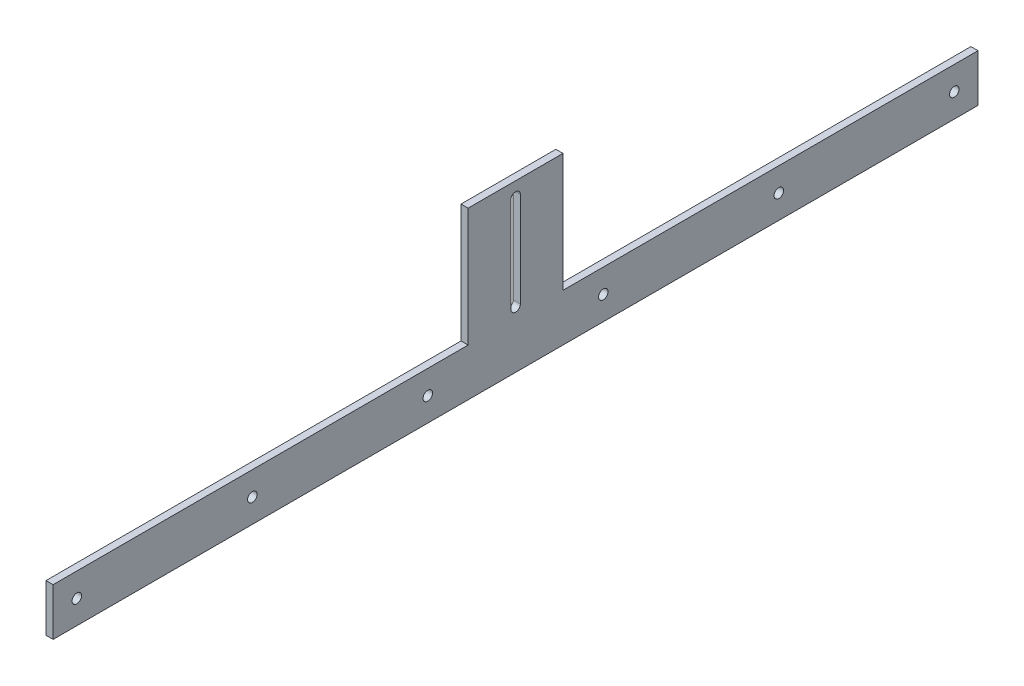
ISO-10303-21;
HEADER;
FILE_DESCRIPTION(('STEP AP214'),'2;1');
FILE_NAME('part.step','',(''),(''),'','','');
FILE_SCHEMA(('AUTOMOTIVE_DESIGN { 1 0 10303 214 1 1 1 1 }'));
ENDSEC;
DATA;
#1=APPLICATION_CONTEXT('core data for automotive mechanical design processes');
#2=APPLICATION_PROTOCOL_DEFINITION('international standard','automotive_design',2000,#1);
#3=PRODUCT_CONTEXT('',#1,'mechanical');
#4=PRODUCT('Part','Part','',(#3));
#5=PRODUCT_RELATED_PRODUCT_CATEGORY('part','',(#4));
#6=PRODUCT_DEFINITION_FORMATION('','',#4);
#7=PRODUCT_DEFINITION_CONTEXT('part definition',#1,'design');
#8=PRODUCT_DEFINITION('design','',#6,#7);
#9=PRODUCT_DEFINITION_SHAPE('','',#8);
#10=(LENGTH_UNIT() NAMED_UNIT(*) SI_UNIT(.MILLI.,.METRE.));
#11=(NAMED_UNIT(*) PLANE_ANGLE_UNIT() SI_UNIT($,.RADIAN.));
#12=(NAMED_UNIT(*) SI_UNIT($,.STERADIAN.) SOLID_ANGLE_UNIT());
#13=UNCERTAINTY_MEASURE_WITH_UNIT(LENGTH_MEASURE(1.E-05),#10,'distance_accuracy_value','');
#14=(GEOMETRIC_REPRESENTATION_CONTEXT(3) GLOBAL_UNCERTAINTY_ASSIGNED_CONTEXT((#13)) GLOBAL_UNIT_ASSIGNED_CONTEXT((#10,
#11,#12)) REPRESENTATION_CONTEXT('',''));
#15=CARTESIAN_POINT('',(0.,0.,0.));
#16=DIRECTION('',(0.,0.,1.));
#17=DIRECTION('',(1.,0.,0.));
#18=AXIS2_PLACEMENT_3D('',#15,#16,#17);
#19=CARTESIAN_POINT('',(3.,20.,0.));
#20=DIRECTION('',(0.,-1.,0.));
#21=DIRECTION('',(0.,0.,-1.));
#22=AXIS2_PLACEMENT_3D('',#19,#20,#21);
#23=PLANE('',#22);
#24=DIRECTION('',(1.,0.,0.));
#25=VECTOR('',#24,1.);
#26=CARTESIAN_POINT('',(0.,20.,-175.));
#27=LINE('',#26,#25);
#28=CARTESIAN_POINT('',(0.,20.,-175.));
#29=VERTEX_POINT('',#28);
#30=CARTESIAN_POINT('',(3.,20.,-175.));
#31=VERTEX_POINT('',#30);
#32=EDGE_CURVE('E186',#29,#31,#27,.T.);
#33=ORIENTED_EDGE('',*,*,#32,.F.);
#34=DIRECTION('',(0.,0.,1.));
#35=VECTOR('',#34,1.);
#36=CARTESIAN_POINT('',(0.,20.,0.));
#37=LINE('',#36,#35);
#38=CARTESIAN_POINT('',(0.,20.,0.));
#39=VERTEX_POINT('',#38);
#40=EDGE_CURVE('E81',#29,#39,#37,.T.);
#41=ORIENTED_EDGE('',*,*,#40,.T.);
#42=DIRECTION('',(-1.,0.,0.));
#43=VECTOR('',#42,1.);
#44=CARTESIAN_POINT('',(3.,20.,0.));
#45=LINE('',#44,#43);
#46=CARTESIAN_POINT('',(3.,20.,0.));
#47=VERTEX_POINT('',#46);
#48=EDGE_CURVE('E244',#47,#39,#45,.T.);
#49=ORIENTED_EDGE('',*,*,#48,.F.);
#50=DIRECTION('',(0.,0.,1.));
#51=VECTOR('',#50,1.);
#52=CARTESIAN_POINT('',(3.,20.,0.));
#53=LINE('',#52,#51);
#54=EDGE_CURVE('E59',#31,#47,#53,.T.);
#55=ORIENTED_EDGE('',*,*,#54,.F.);
#56=EDGE_LOOP('',(#33,#41,#49,#55));
#57=FACE_BOUND('',#56,.T.);
#58=ADVANCED_FACE('F35',(#57),#23,.F.);
#59=CARTESIAN_POINT('',(3.,0.,0.));
#60=DIRECTION('',(-1.,0.,0.));
#61=DIRECTION('',(0.,0.,1.));
#62=AXIS2_PLACEMENT_3D('',#59,#60,#61);
#63=PLANE('',#62);
#64=DIRECTION('',(0.,-1.,0.));
#65=VECTOR('',#64,1.);
#66=CARTESIAN_POINT('',(3.,0.,0.));
#67=LINE('',#66,#65);
#68=CARTESIAN_POINT('',(3.,0.,0.));
#69=VERTEX_POINT('',#68);
#70=EDGE_CURVE('E235',#47,#69,#67,.T.);
#71=ORIENTED_EDGE('',*,*,#70,.T.);
#72=DIRECTION('',(0.,0.,-1.));
#73=VECTOR('',#72,1.);
#74=CARTESIAN_POINT('',(3.,0.,0.));
#75=LINE('',#74,#73);
#76=CARTESIAN_POINT('',(3.,0.,-390.));
#77=VERTEX_POINT('',#76);
#78=EDGE_CURVE('E88',#69,#77,#75,.T.);
#79=ORIENTED_EDGE('',*,*,#78,.T.);
#80=DIRECTION('',(0.,1.,0.));
#81=VECTOR('',#80,1.);
#82=CARTESIAN_POINT('',(3.,0.,-390.));
#83=LINE('',#82,#81);
#84=CARTESIAN_POINT('',(3.,20.,-390.));
#85=VERTEX_POINT('',#84);
#86=EDGE_CURVE('E239',#77,#85,#83,.T.);
#87=ORIENTED_EDGE('',*,*,#86,.T.);
#88=CARTESIAN_POINT('',(3.,20.,-215.));
#89=VERTEX_POINT('',#88);
#90=EDGE_CURVE('E241',#85,#89,#53,.T.);
#91=ORIENTED_EDGE('',*,*,#90,.T.);
#92=DIRECTION('',(0.,1.,0.));
#93=VECTOR('',#92,1.);
#94=CARTESIAN_POINT('',(3.,70.,-215.));
#95=LINE('',#94,#93);
#96=CARTESIAN_POINT('',(3.,70.,-215.));
#97=VERTEX_POINT('',#96);
#98=EDGE_CURVE('E50',#89,#97,#95,.T.);
#99=ORIENTED_EDGE('',*,*,#98,.T.);
#100=DIRECTION('',(0.,0.,1.));
#101=VECTOR('',#100,1.);
#102=CARTESIAN_POINT('',(3.,70.,-175.));
#103=LINE('',#102,#101);
#104=CARTESIAN_POINT('',(3.,70.,-175.));
#105=VERTEX_POINT('',#104);
#106=EDGE_CURVE('E180',#97,#105,#103,.T.);
#107=ORIENTED_EDGE('',*,*,#106,.T.);
#108=DIRECTION('',(0.,-1.,0.));
#109=VECTOR('',#108,1.);
#110=CARTESIAN_POINT('',(3.,70.,-175.));
#111=LINE('',#110,#109);
#112=EDGE_CURVE('E173',#105,#31,#111,.T.);
#113=ORIENTED_EDGE('',*,*,#112,.T.);
#114=ORIENTED_EDGE('',*,*,#54,.T.);
#115=EDGE_LOOP('',(#71,#79,#87,#91,#99,#107,#113,#114));
#116=FACE_BOUND('',#115,.T.);
#117=CARTESIAN_POINT('',(3.,10.,-10.));
#118=DIRECTION('',(1.,0.,0.));
#119=DIRECTION('',(0.,0.,-1.));
#120=AXIS2_PLACEMENT_3D('',#117,#118,#119);
#121=CIRCLE('',#120,2.);
#122=CARTESIAN_POINT('',(3.,10.,-12.));
#123=VERTEX_POINT('',#122);
#124=EDGE_CURVE('E229',#123,#123,#121,.T.);
#125=ORIENTED_EDGE('',*,*,#124,.F.);
#126=EDGE_LOOP('',(#125));
#127=FACE_BOUND('',#126,.T.);
#128=CARTESIAN_POINT('',(3.,10.,-380.));
#129=DIRECTION('',(1.,0.,0.));
#130=DIRECTION('',(0.,0.,-1.));
#131=AXIS2_PLACEMENT_3D('',#128,#129,#130);
#132=CIRCLE('',#131,2.);
#133=CARTESIAN_POINT('',(3.,10.,-382.));
#134=VERTEX_POINT('',#133);
#135=EDGE_CURVE('E223',#134,#134,#132,.T.);
#136=ORIENTED_EDGE('',*,*,#135,.F.);
#137=EDGE_LOOP('',(#136));
#138=FACE_BOUND('',#137,.T.);
#139=CARTESIAN_POINT('',(3.,10.,-84.));
#140=DIRECTION('',(1.,0.,0.));
#141=DIRECTION('',(0.,0.,-1.));
#142=AXIS2_PLACEMENT_3D('',#139,#140,#141);
#143=CIRCLE('',#142,2.);
#144=CARTESIAN_POINT('',(3.,10.,-86.));
#145=VERTEX_POINT('',#144);
#146=EDGE_CURVE('E217',#145,#145,#143,.T.);
#147=ORIENTED_EDGE('',*,*,#146,.F.);
#148=EDGE_LOOP('',(#147));
#149=FACE_BOUND('',#148,.T.);
#150=CARTESIAN_POINT('',(3.,10.,-158.));
#151=DIRECTION('',(1.,0.,0.));
#152=DIRECTION('',(0.,0.,-1.));
#153=AXIS2_PLACEMENT_3D('',#150,#151,#152);
#154=CIRCLE('',#153,2.00000000000003);
#155=CARTESIAN_POINT('',(3.,10.,-160.));
#156=VERTEX_POINT('',#155);
#157=EDGE_CURVE('E211',#156,#156,#154,.T.);
#158=ORIENTED_EDGE('',*,*,#157,.F.);
#159=EDGE_LOOP('',(#158));
#160=FACE_BOUND('',#159,.T.);
#161=CARTESIAN_POINT('',(3.,10.,-232.));
#162=DIRECTION('',(1.,0.,0.));
#163=DIRECTION('',(0.,0.,-1.));
#164=AXIS2_PLACEMENT_3D('',#161,#162,#163);
#165=CIRCLE('',#164,2.);
#166=CARTESIAN_POINT('',(3.,10.,-234.));
#167=VERTEX_POINT('',#166);
#168=EDGE_CURVE('E205',#167,#167,#165,.T.);
#169=ORIENTED_EDGE('',*,*,#168,.F.);
#170=EDGE_LOOP('',(#169));
#171=FACE_BOUND('',#170,.T.);
#172=CARTESIAN_POINT('',(3.,10.,-306.));
#173=DIRECTION('',(1.,0.,0.));
#174=DIRECTION('',(0.,0.,-1.));
#175=AXIS2_PLACEMENT_3D('',#172,#173,#174);
#176=CIRCLE('',#175,2.);
#177=CARTESIAN_POINT('',(3.,10.,-308.));
#178=VERTEX_POINT('',#177);
#179=EDGE_CURVE('E199',#178,#178,#176,.T.);
#180=ORIENTED_EDGE('',*,*,#179,.F.);
#181=EDGE_LOOP('',(#180));
#182=FACE_BOUND('',#181,.T.);
#183=CARTESIAN_POINT('',(3.,64.,-195.));
#184=DIRECTION('',(1.,0.,0.));
#185=DIRECTION('',(0.,0.,-1.));
#186=AXIS2_PLACEMENT_3D('',#183,#184,#185);
#187=CIRCLE('',#186,2.);
#188=CARTESIAN_POINT('',(3.,64.,-197.));
#189=VERTEX_POINT('',#188);
#190=CARTESIAN_POINT('',(3.,64.,-193.));
#191=VERTEX_POINT('',#190);
#192=EDGE_CURVE('E141',#189,#191,#187,.T.);
#193=ORIENTED_EDGE('',*,*,#192,.F.);
#194=DIRECTION('',(0.,1.,0.));
#195=VECTOR('',#194,1.);
#196=CARTESIAN_POINT('',(3.,64.,-197.));
#197=LINE('',#196,#195);
#198=CARTESIAN_POINT('',(3.,24.,-197.));
#199=VERTEX_POINT('',#198);
#200=EDGE_CURVE('E158',#199,#189,#197,.T.);
#201=ORIENTED_EDGE('',*,*,#200,.F.);
#202=CARTESIAN_POINT('',(3.,24.,-195.));
#203=DIRECTION('',(1.,0.,0.));
#204=DIRECTION('',(0.,0.,-1.));
#205=AXIS2_PLACEMENT_3D('',#202,#203,#204);
#206=CIRCLE('',#205,2.);
#207=CARTESIAN_POINT('',(3.,24.,-193.));
#208=VERTEX_POINT('',#207);
#209=EDGE_CURVE('E161',#208,#199,#206,.T.);
#210=ORIENTED_EDGE('',*,*,#209,.F.);
#211=DIRECTION('',(0.,-1.,0.));
#212=VECTOR('',#211,1.);
#213=CARTESIAN_POINT('',(3.,64.,-193.));
#214=LINE('',#213,#212);
#215=EDGE_CURVE('E167',#191,#208,#214,.T.);
#216=ORIENTED_EDGE('',*,*,#215,.F.);
#217=EDGE_LOOP('',(#193,#201,#210,#216));
#218=FACE_BOUND('',#217,.T.);
#219=ADVANCED_FACE('F271',(#116,#127,#138,#149,#160,#171,#182,#218),#63,.F.);
#220=CARTESIAN_POINT('',(0.,0.,0.));
#221=DIRECTION('',(-1.,0.,0.));
#222=DIRECTION('',(0.,0.,1.));
#223=AXIS2_PLACEMENT_3D('',#220,#221,#222);
#224=PLANE('',#223);
#225=CARTESIAN_POINT('',(0.,10.,-232.));
#226=DIRECTION('',(1.,0.,0.));
#227=DIRECTION('',(0.,0.,-1.));
#228=AXIS2_PLACEMENT_3D('',#225,#226,#227);
#229=CIRCLE('',#228,2.);
#230=CARTESIAN_POINT('',(0.,10.,-234.));
#231=VERTEX_POINT('',#230);
#232=EDGE_CURVE('E202',#231,#231,#229,.T.);
#233=ORIENTED_EDGE('',*,*,#232,.T.);
#234=EDGE_LOOP('',(#233));
#235=FACE_BOUND('',#234,.T.);
#236=CARTESIAN_POINT('',(0.,10.,-84.));
#237=DIRECTION('',(1.,0.,0.));
#238=DIRECTION('',(0.,0.,-1.));
#239=AXIS2_PLACEMENT_3D('',#236,#237,#238);
#240=CIRCLE('',#239,2.);
#241=CARTESIAN_POINT('',(0.,10.,-86.));
#242=VERTEX_POINT('',#241);
#243=EDGE_CURVE('E214',#242,#242,#240,.T.);
#244=ORIENTED_EDGE('',*,*,#243,.T.);
#245=EDGE_LOOP('',(#244));
#246=FACE_BOUND('',#245,.T.);
#247=CARTESIAN_POINT('',(0.,10.,-10.));
#248=DIRECTION('',(1.,0.,0.));
#249=DIRECTION('',(0.,0.,-1.));
#250=AXIS2_PLACEMENT_3D('',#247,#248,#249);
#251=CIRCLE('',#250,2.);
#252=CARTESIAN_POINT('',(0.,10.,-12.));
#253=VERTEX_POINT('',#252);
#254=EDGE_CURVE('E226',#253,#253,#251,.T.);
#255=ORIENTED_EDGE('',*,*,#254,.T.);
#256=EDGE_LOOP('',(#255));
#257=FACE_BOUND('',#256,.T.);
#258=DIRECTION('',(0.,-1.,0.));
#259=VECTOR('',#258,1.);
#260=CARTESIAN_POINT('',(0.,0.,0.));
#261=LINE('',#260,#259);
#262=CARTESIAN_POINT('',(0.,0.,0.));
#263=VERTEX_POINT('',#262);
#264=EDGE_CURVE('E232',#39,#263,#261,.T.);
#265=ORIENTED_EDGE('',*,*,#264,.F.);
#266=ORIENTED_EDGE('',*,*,#40,.F.);
#267=DIRECTION('',(0.,-1.,0.));
#268=VECTOR('',#267,1.);
#269=CARTESIAN_POINT('',(0.,70.,-175.));
#270=LINE('',#269,#268);
#271=CARTESIAN_POINT('',(0.,70.,-175.));
#272=VERTEX_POINT('',#271);
#273=EDGE_CURVE('E177',#272,#29,#270,.T.);
#274=ORIENTED_EDGE('',*,*,#273,.F.);
#275=DIRECTION('',(0.,0.,1.));
#276=VECTOR('',#275,1.);
#277=CARTESIAN_POINT('',(0.,70.,-175.));
#278=LINE('',#277,#276);
#279=CARTESIAN_POINT('',(0.,70.,-215.));
#280=VERTEX_POINT('',#279);
#281=EDGE_CURVE('E183',#280,#272,#278,.T.);
#282=ORIENTED_EDGE('',*,*,#281,.F.);
#283=DIRECTION('',(0.,1.,0.));
#284=VECTOR('',#283,1.);
#285=CARTESIAN_POINT('',(0.,70.,-215.));
#286=LINE('',#285,#284);
#287=CARTESIAN_POINT('',(0.,20.,-215.));
#288=VERTEX_POINT('',#287);
#289=EDGE_CURVE('E179',#288,#280,#286,.T.);
#290=ORIENTED_EDGE('',*,*,#289,.F.);
#291=CARTESIAN_POINT('',(0.,20.,-390.));
#292=VERTEX_POINT('',#291);
#293=EDGE_CURVE('E237',#292,#288,#37,.T.);
#294=ORIENTED_EDGE('',*,*,#293,.F.);
#295=DIRECTION('',(0.,1.,0.));
#296=VECTOR('',#295,1.);
#297=CARTESIAN_POINT('',(0.,0.,-390.));
#298=LINE('',#297,#296);
#299=CARTESIAN_POINT('',(0.,0.,-390.));
#300=VERTEX_POINT('',#299);
#301=EDGE_CURVE('E249',#300,#292,#298,.T.);
#302=ORIENTED_EDGE('',*,*,#301,.F.);
#303=DIRECTION('',(0.,0.,-1.));
#304=VECTOR('',#303,1.);
#305=CARTESIAN_POINT('',(0.,0.,0.));
#306=LINE('',#305,#304);
#307=EDGE_CURVE('E247',#263,#300,#306,.T.);
#308=ORIENTED_EDGE('',*,*,#307,.F.);
#309=EDGE_LOOP('',(#265,#266,#274,#282,#290,#294,#302,#308));
#310=FACE_BOUND('',#309,.T.);
#311=CARTESIAN_POINT('',(0.,10.,-380.));
#312=DIRECTION('',(1.,0.,0.));
#313=DIRECTION('',(0.,0.,-1.));
#314=AXIS2_PLACEMENT_3D('',#311,#312,#313);
#315=CIRCLE('',#314,2.);
#316=CARTESIAN_POINT('',(0.,10.,-382.));
#317=VERTEX_POINT('',#316);
#318=EDGE_CURVE('E220',#317,#317,#315,.T.);
#319=ORIENTED_EDGE('',*,*,#318,.T.);
#320=EDGE_LOOP('',(#319));
#321=FACE_BOUND('',#320,.T.);
#322=CARTESIAN_POINT('',(0.,10.,-158.));
#323=DIRECTION('',(1.,0.,0.));
#324=DIRECTION('',(0.,0.,-1.));
#325=AXIS2_PLACEMENT_3D('',#322,#323,#324);
#326=CIRCLE('',#325,2.00000000000003);
#327=CARTESIAN_POINT('',(0.,10.,-160.));
#328=VERTEX_POINT('',#327);
#329=EDGE_CURVE('E208',#328,#328,#326,.T.);
#330=ORIENTED_EDGE('',*,*,#329,.T.);
#331=EDGE_LOOP('',(#330));
#332=FACE_BOUND('',#331,.T.);
#333=CARTESIAN_POINT('',(0.,10.,-306.));
#334=DIRECTION('',(1.,0.,0.));
#335=DIRECTION('',(0.,0.,-1.));
#336=AXIS2_PLACEMENT_3D('',#333,#334,#335);
#337=CIRCLE('',#336,2.);
#338=CARTESIAN_POINT('',(0.,10.,-308.));
#339=VERTEX_POINT('',#338);
#340=EDGE_CURVE('E193',#339,#339,#337,.T.);
#341=ORIENTED_EDGE('',*,*,#340,.T.);
#342=EDGE_LOOP('',(#341));
#343=FACE_BOUND('',#342,.T.);
#344=DIRECTION('',(0.,1.,0.));
#345=VECTOR('',#344,1.);
#346=CARTESIAN_POINT('',(0.,64.,-197.));
#347=LINE('',#346,#345);
#348=CARTESIAN_POINT('',(0.,24.,-197.));
#349=VERTEX_POINT('',#348);
#350=CARTESIAN_POINT('',(0.,64.,-197.));
#351=VERTEX_POINT('',#350);
#352=EDGE_CURVE('E146',#349,#351,#347,.T.);
#353=ORIENTED_EDGE('',*,*,#352,.T.);
#354=CARTESIAN_POINT('',(0.,64.,-195.));
#355=DIRECTION('',(1.,0.,0.));
#356=DIRECTION('',(0.,0.,-1.));
#357=AXIS2_PLACEMENT_3D('',#354,#355,#356);
#358=CIRCLE('',#357,2.);
#359=CARTESIAN_POINT('',(0.,64.,-193.));
#360=VERTEX_POINT('',#359);
#361=EDGE_CURVE('E138',#351,#360,#358,.T.);
#362=ORIENTED_EDGE('',*,*,#361,.T.);
#363=DIRECTION('',(0.,-1.,0.));
#364=VECTOR('',#363,1.);
#365=CARTESIAN_POINT('',(0.,64.,-193.));
#366=LINE('',#365,#364);
#367=CARTESIAN_POINT('',(0.,24.,-193.));
#368=VERTEX_POINT('',#367);
#369=EDGE_CURVE('E150',#360,#368,#366,.T.);
#370=ORIENTED_EDGE('',*,*,#369,.T.);
#371=CARTESIAN_POINT('',(0.,24.,-195.));
#372=DIRECTION('',(1.,0.,0.));
#373=DIRECTION('',(0.,0.,-1.));
#374=AXIS2_PLACEMENT_3D('',#371,#372,#373);
#375=CIRCLE('',#374,2.);
#376=EDGE_CURVE('E154',#368,#349,#375,.T.);
#377=ORIENTED_EDGE('',*,*,#376,.T.);
#378=EDGE_LOOP('',(#353,#362,#370,#377));
#379=FACE_BOUND('',#378,.T.);
#380=ADVANCED_FACE('F156',(#235,#246,#257,#310,#321,#332,#343,#379),#224,.T.);
#381=CARTESIAN_POINT('',(3.,0.,0.));
#382=DIRECTION('',(0.,0.,-1.));
#383=DIRECTION('',(-1.,0.,0.));
#384=AXIS2_PLACEMENT_3D('',#381,#382,#383);
#385=PLANE('',#384);
#386=ORIENTED_EDGE('',*,*,#264,.T.);
#387=DIRECTION('',(-1.,0.,0.));
#388=VECTOR('',#387,1.);
#389=CARTESIAN_POINT('',(3.,0.,0.));
#390=LINE('',#389,#388);
#391=EDGE_CURVE('E11',#69,#263,#390,.T.);
#392=ORIENTED_EDGE('',*,*,#391,.F.);
#393=ORIENTED_EDGE('',*,*,#70,.F.);
#394=ORIENTED_EDGE('',*,*,#48,.T.);
#395=EDGE_LOOP('',(#386,#392,#393,#394));
#396=FACE_BOUND('',#395,.T.);
#397=ADVANCED_FACE('F37',(#396),#385,.F.);
#398=CARTESIAN_POINT('',(3.,0.,0.));
#399=DIRECTION('',(0.,1.,0.));
#400=DIRECTION('',(0.,0.,1.));
#401=AXIS2_PLACEMENT_3D('',#398,#399,#400);
#402=PLANE('',#401);
#403=ORIENTED_EDGE('',*,*,#307,.T.);
#404=DIRECTION('',(-1.,0.,0.));
#405=VECTOR('',#404,1.);
#406=CARTESIAN_POINT('',(3.,0.,-390.));
#407=LINE('',#406,#405);
#408=EDGE_CURVE('E43',#77,#300,#407,.T.);
#409=ORIENTED_EDGE('',*,*,#408,.F.);
#410=ORIENTED_EDGE('',*,*,#78,.F.);
#411=ORIENTED_EDGE('',*,*,#391,.T.);
#412=EDGE_LOOP('',(#403,#409,#410,#411));
#413=FACE_BOUND('',#412,.T.);
#414=ADVANCED_FACE('F277',(#413),#402,.F.);
#415=CARTESIAN_POINT('',(3.,0.,-390.));
#416=DIRECTION('',(0.,0.,1.));
#417=DIRECTION('',(1.,0.,0.));
#418=AXIS2_PLACEMENT_3D('',#415,#416,#417);
#419=PLANE('',#418);
#420=ORIENTED_EDGE('',*,*,#301,.T.);
#421=DIRECTION('',(-1.,0.,0.));
#422=VECTOR('',#421,1.);
#423=CARTESIAN_POINT('',(3.,20.,-390.));
#424=LINE('',#423,#422);
#425=EDGE_CURVE('E254',#85,#292,#424,.T.);
#426=ORIENTED_EDGE('',*,*,#425,.F.);
#427=ORIENTED_EDGE('',*,*,#86,.F.);
#428=ORIENTED_EDGE('',*,*,#408,.T.);
#429=EDGE_LOOP('',(#420,#426,#427,#428));
#430=FACE_BOUND('',#429,.T.);
#431=ADVANCED_FACE('F260',(#430),#419,.F.);
#432=ORIENTED_EDGE('',*,*,#293,.T.);
#433=DIRECTION('',(1.,0.,0.));
#434=VECTOR('',#433,1.);
#435=CARTESIAN_POINT('',(0.,20.,-215.));
#436=LINE('',#435,#434);
#437=EDGE_CURVE('E196',#288,#89,#436,.T.);
#438=ORIENTED_EDGE('',*,*,#437,.T.);
#439=ORIENTED_EDGE('',*,*,#90,.F.);
#440=ORIENTED_EDGE('',*,*,#425,.T.);
#441=EDGE_LOOP('',(#432,#438,#439,#440));
#442=FACE_BOUND('',#441,.T.);
#443=ADVANCED_FACE('F269',(#442),#23,.F.);
#444=CARTESIAN_POINT('',(3.,10.,-10.));
#445=DIRECTION('',(-1.,0.,0.));
#446=DIRECTION('',(0.,0.,1.));
#447=AXIS2_PLACEMENT_3D('',#444,#445,#446);
#448=CYLINDRICAL_SURFACE('',#447,2.);
#449=ORIENTED_EDGE('',*,*,#124,.T.);
#450=EDGE_LOOP('',(#449));
#451=FACE_BOUND('',#450,.T.);
#452=ORIENTED_EDGE('',*,*,#254,.F.);
#453=EDGE_LOOP('',(#452));
#454=FACE_BOUND('',#453,.T.);
#455=ADVANCED_FACE('F292',(#451,#454),#448,.F.);
#456=CARTESIAN_POINT('',(3.,10.,-380.));
#457=DIRECTION('',(-1.,0.,0.));
#458=DIRECTION('',(0.,0.,1.));
#459=AXIS2_PLACEMENT_3D('',#456,#457,#458);
#460=CYLINDRICAL_SURFACE('',#459,2.);
#461=ORIENTED_EDGE('',*,*,#135,.T.);
#462=EDGE_LOOP('',(#461));
#463=FACE_BOUND('',#462,.T.);
#464=ORIENTED_EDGE('',*,*,#318,.F.);
#465=EDGE_LOOP('',(#464));
#466=FACE_BOUND('',#465,.T.);
#467=ADVANCED_FACE('F296',(#463,#466),#460,.F.);
#468=CARTESIAN_POINT('',(3.,10.,-84.));
#469=DIRECTION('',(-1.,0.,0.));
#470=DIRECTION('',(0.,0.,1.));
#471=AXIS2_PLACEMENT_3D('',#468,#469,#470);
#472=CYLINDRICAL_SURFACE('',#471,2.);
#473=ORIENTED_EDGE('',*,*,#146,.T.);
#474=EDGE_LOOP('',(#473));
#475=FACE_BOUND('',#474,.T.);
#476=ORIENTED_EDGE('',*,*,#243,.F.);
#477=EDGE_LOOP('',(#476));
#478=FACE_BOUND('',#477,.T.);
#479=ADVANCED_FACE('F302',(#475,#478),#472,.F.);
#480=CARTESIAN_POINT('',(3.,10.,-158.));
#481=DIRECTION('',(-1.,0.,0.));
#482=DIRECTION('',(0.,0.,1.));
#483=AXIS2_PLACEMENT_3D('',#480,#481,#482);
#484=CYLINDRICAL_SURFACE('',#483,2.00000000000003);
#485=ORIENTED_EDGE('',*,*,#157,.T.);
#486=EDGE_LOOP('',(#485));
#487=FACE_BOUND('',#486,.T.);
#488=ORIENTED_EDGE('',*,*,#329,.F.);
#489=EDGE_LOOP('',(#488));
#490=FACE_BOUND('',#489,.T.);
#491=ADVANCED_FACE('F318',(#487,#490),#484,.F.);
#492=CARTESIAN_POINT('',(3.,10.,-232.));
#493=DIRECTION('',(-1.,0.,0.));
#494=DIRECTION('',(0.,0.,1.));
#495=AXIS2_PLACEMENT_3D('',#492,#493,#494);
#496=CYLINDRICAL_SURFACE('',#495,2.);
#497=ORIENTED_EDGE('',*,*,#168,.T.);
#498=EDGE_LOOP('',(#497));
#499=FACE_BOUND('',#498,.T.);
#500=ORIENTED_EDGE('',*,*,#232,.F.);
#501=EDGE_LOOP('',(#500));
#502=FACE_BOUND('',#501,.T.);
#503=ADVANCED_FACE('F323',(#499,#502),#496,.F.);
#504=CARTESIAN_POINT('',(3.,10.,-306.));
#505=DIRECTION('',(-1.,0.,0.));
#506=DIRECTION('',(0.,0.,1.));
#507=AXIS2_PLACEMENT_3D('',#504,#505,#506);
#508=CYLINDRICAL_SURFACE('',#507,2.);
#509=ORIENTED_EDGE('',*,*,#179,.T.);
#510=EDGE_LOOP('',(#509));
#511=FACE_BOUND('',#510,.T.);
#512=ORIENTED_EDGE('',*,*,#340,.F.);
#513=EDGE_LOOP('',(#512));
#514=FACE_BOUND('',#513,.T.);
#515=ADVANCED_FACE('F329',(#511,#514),#508,.F.);
#516=CARTESIAN_POINT('',(0.,70.,-175.));
#517=DIRECTION('',(0.,0.,1.));
#518=DIRECTION('',(1.,0.,0.));
#519=AXIS2_PLACEMENT_3D('',#516,#517,#518);
#520=PLANE('',#519);
#521=ORIENTED_EDGE('',*,*,#112,.F.);
#522=DIRECTION('',(1.,0.,0.));
#523=VECTOR('',#522,1.);
#524=CARTESIAN_POINT('',(0.,70.,-175.));
#525=LINE('',#524,#523);
#526=EDGE_CURVE('E191',#272,#105,#525,.T.);
#527=ORIENTED_EDGE('',*,*,#526,.F.);
#528=ORIENTED_EDGE('',*,*,#273,.T.);
#529=ORIENTED_EDGE('',*,*,#32,.T.);
#530=EDGE_LOOP('',(#521,#527,#528,#529));
#531=FACE_BOUND('',#530,.T.);
#532=ADVANCED_FACE('F333',(#531),#520,.T.);
#533=CARTESIAN_POINT('',(0.,70.,-175.));
#534=DIRECTION('',(0.,1.,0.));
#535=DIRECTION('',(0.,0.,1.));
#536=AXIS2_PLACEMENT_3D('',#533,#534,#535);
#537=PLANE('',#536);
#538=ORIENTED_EDGE('',*,*,#106,.F.);
#539=DIRECTION('',(1.,0.,0.));
#540=VECTOR('',#539,1.);
#541=CARTESIAN_POINT('',(0.,70.,-215.));
#542=LINE('',#541,#540);
#543=EDGE_CURVE('E194',#280,#97,#542,.T.);
#544=ORIENTED_EDGE('',*,*,#543,.F.);
#545=ORIENTED_EDGE('',*,*,#281,.T.);
#546=ORIENTED_EDGE('',*,*,#526,.T.);
#547=EDGE_LOOP('',(#538,#544,#545,#546));
#548=FACE_BOUND('',#547,.T.);
#549=ADVANCED_FACE('F337',(#548),#537,.T.);
#550=CARTESIAN_POINT('',(0.,70.,-215.));
#551=DIRECTION('',(0.,0.,-1.));
#552=DIRECTION('',(-1.,0.,0.));
#553=AXIS2_PLACEMENT_3D('',#550,#551,#552);
#554=PLANE('',#553);
#555=ORIENTED_EDGE('',*,*,#98,.F.);
#556=ORIENTED_EDGE('',*,*,#437,.F.);
#557=ORIENTED_EDGE('',*,*,#289,.T.);
#558=ORIENTED_EDGE('',*,*,#543,.T.);
#559=EDGE_LOOP('',(#555,#556,#557,#558));
#560=FACE_BOUND('',#559,.T.);
#561=ADVANCED_FACE('F339',(#560),#554,.T.);
#562=CARTESIAN_POINT('',(0.,64.,-195.));
#563=DIRECTION('',(1.,0.,0.));
#564=DIRECTION('',(0.,0.,-1.));
#565=AXIS2_PLACEMENT_3D('',#562,#563,#564);
#566=CYLINDRICAL_SURFACE('',#565,2.);
#567=ORIENTED_EDGE('',*,*,#192,.T.);
#568=DIRECTION('',(1.,0.,0.));
#569=VECTOR('',#568,1.);
#570=CARTESIAN_POINT('',(0.,64.,-193.));
#571=LINE('',#570,#569);
#572=EDGE_CURVE('E134',#360,#191,#571,.T.);
#573=ORIENTED_EDGE('',*,*,#572,.F.);
#574=ORIENTED_EDGE('',*,*,#361,.F.);
#575=DIRECTION('',(1.,0.,0.));
#576=VECTOR('',#575,1.);
#577=CARTESIAN_POINT('',(0.,64.,-197.));
#578=LINE('',#577,#576);
#579=EDGE_CURVE('E171',#351,#189,#578,.T.);
#580=ORIENTED_EDGE('',*,*,#579,.T.);
#581=EDGE_LOOP('',(#567,#573,#574,#580));
#582=FACE_BOUND('',#581,.T.);
#583=ADVANCED_FACE('F136',(#582),#566,.F.);
#584=CARTESIAN_POINT('',(0.,64.,-197.));
#585=DIRECTION('',(0.,0.,-1.));
#586=DIRECTION('',(-1.,0.,0.));
#587=AXIS2_PLACEMENT_3D('',#584,#585,#586);
#588=PLANE('',#587);
#589=ORIENTED_EDGE('',*,*,#200,.T.);
#590=ORIENTED_EDGE('',*,*,#579,.F.);
#591=ORIENTED_EDGE('',*,*,#352,.F.);
#592=DIRECTION('',(1.,0.,0.));
#593=VECTOR('',#592,1.);
#594=CARTESIAN_POINT('',(0.,24.,-197.));
#595=LINE('',#594,#593);
#596=EDGE_CURVE('E174',#349,#199,#595,.T.);
#597=ORIENTED_EDGE('',*,*,#596,.T.);
#598=EDGE_LOOP('',(#589,#590,#591,#597));
#599=FACE_BOUND('',#598,.T.);
#600=ADVANCED_FACE('F347',(#599),#588,.F.);
#601=CARTESIAN_POINT('',(0.,24.,-195.));
#602=DIRECTION('',(1.,0.,0.));
#603=DIRECTION('',(0.,0.,-1.));
#604=AXIS2_PLACEMENT_3D('',#601,#602,#603);
#605=CYLINDRICAL_SURFACE('',#604,2.);
#606=ORIENTED_EDGE('',*,*,#209,.T.);
#607=ORIENTED_EDGE('',*,*,#596,.F.);
#608=ORIENTED_EDGE('',*,*,#376,.F.);
#609=DIRECTION('',(1.,0.,0.));
#610=VECTOR('',#609,1.);
#611=CARTESIAN_POINT('',(0.,24.,-193.));
#612=LINE('',#611,#610);
#613=EDGE_CURVE('E145',#368,#208,#612,.T.);
#614=ORIENTED_EDGE('',*,*,#613,.T.);
#615=EDGE_LOOP('',(#606,#607,#608,#614));
#616=FACE_BOUND('',#615,.T.);
#617=ADVANCED_FACE('F350',(#616),#605,.F.);
#618=CARTESIAN_POINT('',(0.,64.,-193.));
#619=DIRECTION('',(0.,0.,1.));
#620=DIRECTION('',(1.,0.,0.));
#621=AXIS2_PLACEMENT_3D('',#618,#619,#620);
#622=PLANE('',#621);
#623=ORIENTED_EDGE('',*,*,#215,.T.);
#624=ORIENTED_EDGE('',*,*,#613,.F.);
#625=ORIENTED_EDGE('',*,*,#369,.F.);
#626=ORIENTED_EDGE('',*,*,#572,.T.);
#627=EDGE_LOOP('',(#623,#624,#625,#626));
#628=FACE_BOUND('',#627,.T.);
#629=ADVANCED_FACE('F151',(#628),#622,.F.);
#630=CLOSED_SHELL('',(#58,#219,#380,#397,#414,#431,#443,#455,#467,#479,#491,#503,#515,#532,#549,
#561,#583,#600,#617,#629));
#631=MANIFOLD_SOLID_BREP('B2',#630);
#632=ADVANCED_BREP_SHAPE_REPRESENTATION('',(#18,#631),#14);
#633=SHAPE_DEFINITION_REPRESENTATION(#9,#632);
ENDSEC;
END-ISO-10303-21;
